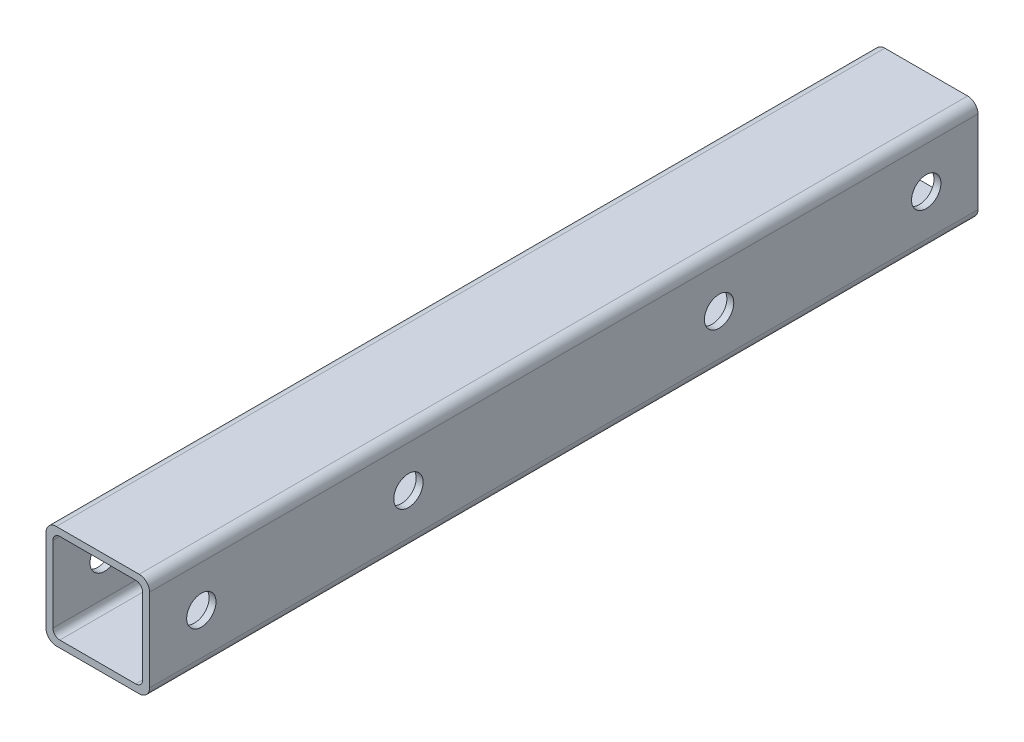
ISO-10303-21;
HEADER;
FILE_DESCRIPTION(('STEP AP214'),'2;1');
FILE_NAME('part.step','',(''),(''),'','','');
FILE_SCHEMA(('AUTOMOTIVE_DESIGN { 1 0 10303 214 1 1 1 1 }'));
ENDSEC;
DATA;
#1=APPLICATION_CONTEXT('core data for automotive mechanical design processes');
#2=APPLICATION_PROTOCOL_DEFINITION('international standard','automotive_design',2000,#1);
#3=PRODUCT_CONTEXT('',#1,'mechanical');
#4=PRODUCT('Part','Part','',(#3));
#5=PRODUCT_RELATED_PRODUCT_CATEGORY('part','',(#4));
#6=PRODUCT_DEFINITION_FORMATION('','',#4);
#7=PRODUCT_DEFINITION_CONTEXT('part definition',#1,'design');
#8=PRODUCT_DEFINITION('design','',#6,#7);
#9=PRODUCT_DEFINITION_SHAPE('','',#8);
#10=(LENGTH_UNIT() NAMED_UNIT(*) SI_UNIT(.MILLI.,.METRE.));
#11=(NAMED_UNIT(*) PLANE_ANGLE_UNIT() SI_UNIT($,.RADIAN.));
#12=(NAMED_UNIT(*) SI_UNIT($,.STERADIAN.) SOLID_ANGLE_UNIT());
#13=UNCERTAINTY_MEASURE_WITH_UNIT(LENGTH_MEASURE(1.E-05),#10,'distance_accuracy_value','');
#14=(GEOMETRIC_REPRESENTATION_CONTEXT(3) GLOBAL_UNCERTAINTY_ASSIGNED_CONTEXT((#13)) GLOBAL_UNIT_ASSIGNED_CONTEXT((#10,
#11,#12)) REPRESENTATION_CONTEXT('',''));
#15=CARTESIAN_POINT('',(0.,0.,0.));
#16=DIRECTION('',(0.,0.,1.));
#17=DIRECTION('',(1.,0.,0.));
#18=AXIS2_PLACEMENT_3D('',#15,#16,#17);
#19=CARTESIAN_POINT('',(-15.,27.,282.426406871193));
#20=DIRECTION('',(1.,0.,0.));
#21=DIRECTION('',(0.,0.,-1.));
#22=AXIS2_PLACEMENT_3D('',#19,#20,#21);
#23=PLANE('',#22);
#24=CARTESIAN_POINT('',(-15.,15.,225.));
#25=DIRECTION('',(1.,0.,0.));
#26=DIRECTION('',(0.,1.,0.));
#27=AXIS2_PLACEMENT_3D('',#24,#25,#26);
#28=CIRCLE('',#27,4.25);
#29=CARTESIAN_POINT('',(-15.,19.25,225.));
#30=VERTEX_POINT('',#29);
#31=EDGE_CURVE('E225',#30,#30,#28,.T.);
#32=ORIENTED_EDGE('',*,*,#31,.T.);
#33=EDGE_LOOP('',(#32));
#34=FACE_BOUND('',#33,.T.);
#35=CARTESIAN_POINT('',(-15.,15.,165.));
#36=DIRECTION('',(1.,0.,0.));
#37=DIRECTION('',(0.,1.,0.));
#38=AXIS2_PLACEMENT_3D('',#35,#36,#37);
#39=CIRCLE('',#38,4.25);
#40=CARTESIAN_POINT('',(-15.,19.25,165.));
#41=VERTEX_POINT('',#40);
#42=EDGE_CURVE('E534',#41,#41,#39,.T.);
#43=ORIENTED_EDGE('',*,*,#42,.T.);
#44=EDGE_LOOP('',(#43));
#45=FACE_BOUND('',#44,.T.);
#46=CARTESIAN_POINT('',(-15.,15.,74.9999999999999));
#47=DIRECTION('',(1.,0.,0.));
#48=DIRECTION('',(0.,1.,0.));
#49=AXIS2_PLACEMENT_3D('',#46,#47,#48);
#50=CIRCLE('',#49,4.25);
#51=CARTESIAN_POINT('',(-15.,19.25,74.9999999999999));
#52=VERTEX_POINT('',#51);
#53=EDGE_CURVE('E542',#52,#52,#50,.T.);
#54=ORIENTED_EDGE('',*,*,#53,.T.);
#55=EDGE_LOOP('',(#54));
#56=FACE_BOUND('',#55,.T.);
#57=CARTESIAN_POINT('',(-15.,15.,15.));
#58=DIRECTION('',(1.,0.,0.));
#59=DIRECTION('',(0.,1.,0.));
#60=AXIS2_PLACEMENT_3D('',#57,#58,#59);
#61=CIRCLE('',#60,4.25);
#62=CARTESIAN_POINT('',(-15.,19.25,15.));
#63=VERTEX_POINT('',#62);
#64=EDGE_CURVE('E548',#63,#63,#61,.T.);
#65=ORIENTED_EDGE('',*,*,#64,.T.);
#66=EDGE_LOOP('',(#65));
#67=FACE_BOUND('',#66,.T.);
#68=DIRECTION('',(0.,-1.,0.));
#69=VECTOR('',#68,1.);
#70=CARTESIAN_POINT('',(-15.,27.,240.));
#71=LINE('',#70,#69);
#72=CARTESIAN_POINT('',(-15.,27.,240.));
#73=VERTEX_POINT('',#72);
#74=CARTESIAN_POINT('',(-15.,3.00000000000001,240.));
#75=VERTEX_POINT('',#74);
#76=EDGE_CURVE('E259',#73,#75,#71,.T.);
#77=ORIENTED_EDGE('',*,*,#76,.F.);
#78=DIRECTION('',(0.,0.,-1.));
#79=VECTOR('',#78,1.);
#80=CARTESIAN_POINT('',(-15.,27.,282.426406871193));
#81=LINE('',#80,#79);
#82=CARTESIAN_POINT('',(-15.,27.,0.));
#83=VERTEX_POINT('',#82);
#84=EDGE_CURVE('E52',#73,#83,#81,.T.);
#85=ORIENTED_EDGE('',*,*,#84,.T.);
#86=DIRECTION('',(0.,-1.,0.));
#87=VECTOR('',#86,1.);
#88=CARTESIAN_POINT('',(-15.,27.,0.));
#89=LINE('',#88,#87);
#90=CARTESIAN_POINT('',(-15.,3.,0.));
#91=VERTEX_POINT('',#90);
#92=EDGE_CURVE('E204',#83,#91,#89,.T.);
#93=ORIENTED_EDGE('',*,*,#92,.T.);
#94=DIRECTION('',(0.,0.,-1.));
#95=VECTOR('',#94,1.);
#96=CARTESIAN_POINT('',(-15.,3.,282.426406871193));
#97=LINE('',#96,#95);
#98=EDGE_CURVE('E207',#75,#91,#97,.T.);
#99=ORIENTED_EDGE('',*,*,#98,.F.);
#100=EDGE_LOOP('',(#77,#85,#93,#99));
#101=FACE_BOUND('',#100,.T.);
#102=ADVANCED_FACE('F35',(#34,#45,#56,#67,#101),#23,.F.);
#103=CARTESIAN_POINT('',(-12.,27.,282.426406871193));
#104=DIRECTION('',(0.,0.,-1.));
#105=DIRECTION('',(-1.,0.,0.));
#106=AXIS2_PLACEMENT_3D('',#103,#104,#105);
#107=CYLINDRICAL_SURFACE('',#106,3.);
#108=CARTESIAN_POINT('',(-12.,27.,240.));
#109=DIRECTION('',(0.,0.,1.));
#110=DIRECTION('',(1.,0.,0.));
#111=AXIS2_PLACEMENT_3D('',#108,#109,#110);
#112=CIRCLE('',#111,3.);
#113=CARTESIAN_POINT('',(-12.,30.,240.));
#114=VERTEX_POINT('',#113);
#115=EDGE_CURVE('E262',#114,#73,#112,.T.);
#116=ORIENTED_EDGE('',*,*,#115,.F.);
#117=DIRECTION('',(0.,0.,-1.));
#118=VECTOR('',#117,1.);
#119=CARTESIAN_POINT('',(-12.,30.,282.426406871193));
#120=LINE('',#119,#118);
#121=CARTESIAN_POINT('',(-12.,30.,0.));
#122=VERTEX_POINT('',#121);
#123=EDGE_CURVE('E210',#114,#122,#120,.T.);
#124=ORIENTED_EDGE('',*,*,#123,.T.);
#125=CARTESIAN_POINT('',(-12.,27.,0.));
#126=DIRECTION('',(0.,0.,1.));
#127=DIRECTION('',(1.,0.,0.));
#128=AXIS2_PLACEMENT_3D('',#125,#126,#127);
#129=CIRCLE('',#128,3.);
#130=EDGE_CURVE('E202',#122,#83,#129,.T.);
#131=ORIENTED_EDGE('',*,*,#130,.T.);
#132=ORIENTED_EDGE('',*,*,#84,.F.);
#133=EDGE_LOOP('',(#116,#124,#131,#132));
#134=FACE_BOUND('',#133,.T.);
#135=ADVANCED_FACE('F338',(#134),#107,.T.);
#136=CARTESIAN_POINT('',(-12.,30.,282.426406871193));
#137=DIRECTION('',(0.,-1.,0.));
#138=DIRECTION('',(0.,0.,-1.));
#139=AXIS2_PLACEMENT_3D('',#136,#137,#138);
#140=PLANE('',#139);
#141=DIRECTION('',(-1.,0.,0.));
#142=VECTOR('',#141,1.);
#143=CARTESIAN_POINT('',(-12.,30.,240.));
#144=LINE('',#143,#142);
#145=CARTESIAN_POINT('',(12.,30.,240.));
#146=VERTEX_POINT('',#145);
#147=EDGE_CURVE('E265',#146,#114,#144,.T.);
#148=ORIENTED_EDGE('',*,*,#147,.F.);
#149=DIRECTION('',(0.,0.,-1.));
#150=VECTOR('',#149,1.);
#151=CARTESIAN_POINT('',(12.,30.,282.426406871193));
#152=LINE('',#151,#150);
#153=CARTESIAN_POINT('',(12.,30.,0.));
#154=VERTEX_POINT('',#153);
#155=EDGE_CURVE('E212',#146,#154,#152,.T.);
#156=ORIENTED_EDGE('',*,*,#155,.T.);
#157=DIRECTION('',(-1.,0.,0.));
#158=VECTOR('',#157,1.);
#159=CARTESIAN_POINT('',(-12.,30.,0.));
#160=LINE('',#159,#158);
#161=EDGE_CURVE('E199',#154,#122,#160,.T.);
#162=ORIENTED_EDGE('',*,*,#161,.T.);
#163=ORIENTED_EDGE('',*,*,#123,.F.);
#164=EDGE_LOOP('',(#148,#156,#162,#163));
#165=FACE_BOUND('',#164,.T.);
#166=ADVANCED_FACE('F344',(#165),#140,.F.);
#167=CARTESIAN_POINT('',(12.,27.,282.426406871193));
#168=DIRECTION('',(0.,0.,-1.));
#169=DIRECTION('',(-1.,0.,0.));
#170=AXIS2_PLACEMENT_3D('',#167,#168,#169);
#171=CYLINDRICAL_SURFACE('',#170,3.);
#172=CARTESIAN_POINT('',(12.,27.,240.));
#173=DIRECTION('',(0.,0.,1.));
#174=DIRECTION('',(1.,0.,0.));
#175=AXIS2_PLACEMENT_3D('',#172,#173,#174);
#176=CIRCLE('',#175,3.);
#177=CARTESIAN_POINT('',(15.,27.,240.));
#178=VERTEX_POINT('',#177);
#179=EDGE_CURVE('E268',#178,#146,#176,.T.);
#180=ORIENTED_EDGE('',*,*,#179,.F.);
#181=DIRECTION('',(0.,0.,-1.));
#182=VECTOR('',#181,1.);
#183=CARTESIAN_POINT('',(15.,27.,282.426406871193));
#184=LINE('',#183,#182);
#185=CARTESIAN_POINT('',(15.,27.,0.));
#186=VERTEX_POINT('',#185);
#187=EDGE_CURVE('E214',#178,#186,#184,.T.);
#188=ORIENTED_EDGE('',*,*,#187,.T.);
#189=CARTESIAN_POINT('',(12.,27.,0.));
#190=DIRECTION('',(0.,0.,1.));
#191=DIRECTION('',(-1.,0.,0.));
#192=AXIS2_PLACEMENT_3D('',#189,#190,#191);
#193=CIRCLE('',#192,3.);
#194=EDGE_CURVE('E196',#186,#154,#193,.T.);
#195=ORIENTED_EDGE('',*,*,#194,.T.);
#196=ORIENTED_EDGE('',*,*,#155,.F.);
#197=EDGE_LOOP('',(#180,#188,#195,#196));
#198=FACE_BOUND('',#197,.T.);
#199=ADVANCED_FACE('F351',(#198),#171,.T.);
#200=CARTESIAN_POINT('',(15.,27.,282.426406871193));
#201=DIRECTION('',(-1.,0.,0.));
#202=DIRECTION('',(0.,-1.,0.));
#203=AXIS2_PLACEMENT_3D('',#200,#201,#202);
#204=PLANE('',#203);
#205=CARTESIAN_POINT('',(15.,15.,225.));
#206=DIRECTION('',(1.,0.,0.));
#207=DIRECTION('',(0.,1.,0.));
#208=AXIS2_PLACEMENT_3D('',#205,#206,#207);
#209=CIRCLE('',#208,4.25);
#210=CARTESIAN_POINT('',(15.,19.25,225.));
#211=VERTEX_POINT('',#210);
#212=EDGE_CURVE('E531',#211,#211,#209,.T.);
#213=ORIENTED_EDGE('',*,*,#212,.F.);
#214=EDGE_LOOP('',(#213));
#215=FACE_BOUND('',#214,.T.);
#216=CARTESIAN_POINT('',(15.,15.,165.));
#217=DIRECTION('',(1.,0.,0.));
#218=DIRECTION('',(0.,1.,0.));
#219=AXIS2_PLACEMENT_3D('',#216,#217,#218);
#220=CIRCLE('',#219,4.25);
#221=CARTESIAN_POINT('',(15.,19.25,165.));
#222=VERTEX_POINT('',#221);
#223=EDGE_CURVE('E539',#222,#222,#220,.T.);
#224=ORIENTED_EDGE('',*,*,#223,.F.);
#225=EDGE_LOOP('',(#224));
#226=FACE_BOUND('',#225,.T.);
#227=CARTESIAN_POINT('',(15.,15.,74.9999999999999));
#228=DIRECTION('',(1.,0.,0.));
#229=DIRECTION('',(0.,1.,0.));
#230=AXIS2_PLACEMENT_3D('',#227,#228,#229);
#231=CIRCLE('',#230,4.25);
#232=CARTESIAN_POINT('',(15.,19.25,74.9999999999999));
#233=VERTEX_POINT('',#232);
#234=EDGE_CURVE('E545',#233,#233,#231,.T.);
#235=ORIENTED_EDGE('',*,*,#234,.F.);
#236=EDGE_LOOP('',(#235));
#237=FACE_BOUND('',#236,.T.);
#238=CARTESIAN_POINT('',(15.,15.,15.));
#239=DIRECTION('',(1.,0.,0.));
#240=DIRECTION('',(0.,1.,0.));
#241=AXIS2_PLACEMENT_3D('',#238,#239,#240);
#242=CIRCLE('',#241,4.25);
#243=CARTESIAN_POINT('',(15.,19.25,15.));
#244=VERTEX_POINT('',#243);
#245=EDGE_CURVE('E550',#244,#244,#242,.T.);
#246=ORIENTED_EDGE('',*,*,#245,.F.);
#247=EDGE_LOOP('',(#246));
#248=FACE_BOUND('',#247,.T.);
#249=DIRECTION('',(0.,1.,0.));
#250=VECTOR('',#249,1.);
#251=CARTESIAN_POINT('',(15.,27.,240.));
#252=LINE('',#251,#250);
#253=CARTESIAN_POINT('',(15.,3.,240.));
#254=VERTEX_POINT('',#253);
#255=EDGE_CURVE('E271',#254,#178,#252,.T.);
#256=ORIENTED_EDGE('',*,*,#255,.F.);
#257=DIRECTION('',(0.,0.,-1.));
#258=VECTOR('',#257,1.);
#259=CARTESIAN_POINT('',(15.,3.,282.426406871193));
#260=LINE('',#259,#258);
#261=CARTESIAN_POINT('',(15.,3.,0.));
#262=VERTEX_POINT('',#261);
#263=EDGE_CURVE('E216',#254,#262,#260,.T.);
#264=ORIENTED_EDGE('',*,*,#263,.T.);
#265=DIRECTION('',(0.,1.,0.));
#266=VECTOR('',#265,1.);
#267=CARTESIAN_POINT('',(15.,27.,0.));
#268=LINE('',#267,#266);
#269=EDGE_CURVE('E193',#262,#186,#268,.T.);
#270=ORIENTED_EDGE('',*,*,#269,.T.);
#271=ORIENTED_EDGE('',*,*,#187,.F.);
#272=EDGE_LOOP('',(#256,#264,#270,#271));
#273=FACE_BOUND('',#272,.T.);
#274=ADVANCED_FACE('F355',(#215,#226,#237,#248,#273),#204,.F.);
#275=CARTESIAN_POINT('',(12.,3.,282.426406871193));
#276=DIRECTION('',(0.,0.,-1.));
#277=DIRECTION('',(-1.,0.,0.));
#278=AXIS2_PLACEMENT_3D('',#275,#276,#277);
#279=CYLINDRICAL_SURFACE('',#278,3.);
#280=CARTESIAN_POINT('',(12.,3.,240.));
#281=DIRECTION('',(0.,0.,1.));
#282=DIRECTION('',(1.,0.,0.));
#283=AXIS2_PLACEMENT_3D('',#280,#281,#282);
#284=CIRCLE('',#283,3.);
#285=CARTESIAN_POINT('',(12.,0.,240.));
#286=VERTEX_POINT('',#285);
#287=EDGE_CURVE('E274',#286,#254,#284,.T.);
#288=ORIENTED_EDGE('',*,*,#287,.F.);
#289=DIRECTION('',(0.,0.,-1.));
#290=VECTOR('',#289,1.);
#291=CARTESIAN_POINT('',(12.,0.,282.426406871193));
#292=LINE('',#291,#290);
#293=CARTESIAN_POINT('',(12.,0.,0.));
#294=VERTEX_POINT('',#293);
#295=EDGE_CURVE('E218',#286,#294,#292,.T.);
#296=ORIENTED_EDGE('',*,*,#295,.T.);
#297=CARTESIAN_POINT('',(12.,3.,0.));
#298=DIRECTION('',(0.,0.,1.));
#299=DIRECTION('',(1.,0.,0.));
#300=AXIS2_PLACEMENT_3D('',#297,#298,#299);
#301=CIRCLE('',#300,3.);
#302=EDGE_CURVE('E190',#294,#262,#301,.T.);
#303=ORIENTED_EDGE('',*,*,#302,.T.);
#304=ORIENTED_EDGE('',*,*,#263,.F.);
#305=EDGE_LOOP('',(#288,#296,#303,#304));
#306=FACE_BOUND('',#305,.T.);
#307=ADVANCED_FACE('F359',(#306),#279,.T.);
#308=CARTESIAN_POINT('',(-12.,0.,282.426406871193));
#309=DIRECTION('',(0.,1.,0.));
#310=DIRECTION('',(-1.,0.,0.));
#311=AXIS2_PLACEMENT_3D('',#308,#309,#310);
#312=PLANE('',#311);
#313=DIRECTION('',(1.,0.,0.));
#314=VECTOR('',#313,1.);
#315=CARTESIAN_POINT('',(-12.,0.,240.));
#316=LINE('',#315,#314);
#317=CARTESIAN_POINT('',(-12.,0.,240.));
#318=VERTEX_POINT('',#317);
#319=EDGE_CURVE('E277',#318,#286,#316,.T.);
#320=ORIENTED_EDGE('',*,*,#319,.F.);
#321=DIRECTION('',(0.,0.,-1.));
#322=VECTOR('',#321,1.);
#323=CARTESIAN_POINT('',(-12.,0.,282.426406871193));
#324=LINE('',#323,#322);
#325=CARTESIAN_POINT('',(-12.,0.,0.));
#326=VERTEX_POINT('',#325);
#327=EDGE_CURVE('E44',#318,#326,#324,.T.);
#328=ORIENTED_EDGE('',*,*,#327,.T.);
#329=DIRECTION('',(1.,0.,0.));
#330=VECTOR('',#329,1.);
#331=CARTESIAN_POINT('',(-12.,0.,0.));
#332=LINE('',#331,#330);
#333=EDGE_CURVE('E187',#326,#294,#332,.T.);
#334=ORIENTED_EDGE('',*,*,#333,.T.);
#335=ORIENTED_EDGE('',*,*,#295,.F.);
#336=EDGE_LOOP('',(#320,#328,#334,#335));
#337=FACE_BOUND('',#336,.T.);
#338=ADVANCED_FACE('F362',(#337),#312,.F.);
#339=CARTESIAN_POINT('',(-12.,3.,282.426406871193));
#340=DIRECTION('',(0.,0.,-1.));
#341=DIRECTION('',(-1.,0.,0.));
#342=AXIS2_PLACEMENT_3D('',#339,#340,#341);
#343=CYLINDRICAL_SURFACE('',#342,3.);
#344=CARTESIAN_POINT('',(-12.,3.,240.));
#345=DIRECTION('',(0.,0.,1.));
#346=DIRECTION('',(1.,0.,0.));
#347=AXIS2_PLACEMENT_3D('',#344,#345,#346);
#348=CIRCLE('',#347,3.);
#349=EDGE_CURVE('E280',#75,#318,#348,.T.);
#350=ORIENTED_EDGE('',*,*,#349,.F.);
#351=ORIENTED_EDGE('',*,*,#98,.T.);
#352=CARTESIAN_POINT('',(-12.,3.,0.));
#353=DIRECTION('',(0.,0.,1.));
#354=DIRECTION('',(1.,0.,0.));
#355=AXIS2_PLACEMENT_3D('',#352,#353,#354);
#356=CIRCLE('',#355,3.);
#357=EDGE_CURVE('E184',#91,#326,#356,.T.);
#358=ORIENTED_EDGE('',*,*,#357,.T.);
#359=ORIENTED_EDGE('',*,*,#327,.F.);
#360=EDGE_LOOP('',(#350,#351,#358,#359));
#361=FACE_BOUND('',#360,.T.);
#362=ADVANCED_FACE('F37',(#361),#343,.T.);
#363=CARTESIAN_POINT('',(-12.,3.,0.));
#364=DIRECTION('',(0.,0.,1.));
#365=DIRECTION('',(1.,0.,0.));
#366=AXIS2_PLACEMENT_3D('',#363,#364,#365);
#367=PLANE('',#366);
#368=ORIENTED_EDGE('',*,*,#357,.F.);
#369=ORIENTED_EDGE('',*,*,#92,.F.);
#370=ORIENTED_EDGE('',*,*,#130,.F.);
#371=ORIENTED_EDGE('',*,*,#161,.F.);
#372=ORIENTED_EDGE('',*,*,#194,.F.);
#373=ORIENTED_EDGE('',*,*,#269,.F.);
#374=ORIENTED_EDGE('',*,*,#302,.F.);
#375=ORIENTED_EDGE('',*,*,#333,.F.);
#376=EDGE_LOOP('',(#368,#369,#370,#371,#372,#373,#374,#375));
#377=FACE_BOUND('',#376,.T.);
#378=CARTESIAN_POINT('',(-11.,4.00000000000001,0.));
#379=DIRECTION('',(0.,0.,1.));
#380=DIRECTION('',(1.,0.,0.));
#381=AXIS2_PLACEMENT_3D('',#378,#379,#380);
#382=CIRCLE('',#381,2.);
#383=CARTESIAN_POINT('',(-13.,4.00000000000002,0.));
#384=VERTEX_POINT('',#383);
#385=CARTESIAN_POINT('',(-11.,2.00000000000001,0.));
#386=VERTEX_POINT('',#385);
#387=EDGE_CURVE('E283',#384,#386,#382,.T.);
#388=ORIENTED_EDGE('',*,*,#387,.T.);
#389=DIRECTION('',(1.,0.,0.));
#390=VECTOR('',#389,1.);
#391=CARTESIAN_POINT('',(-11.,2.00000000000001,0.));
#392=LINE('',#391,#390);
#393=CARTESIAN_POINT('',(11.,2.,0.));
#394=VERTEX_POINT('',#393);
#395=EDGE_CURVE('E286',#386,#394,#392,.T.);
#396=ORIENTED_EDGE('',*,*,#395,.T.);
#397=CARTESIAN_POINT('',(11.,4.00000000000001,0.));
#398=DIRECTION('',(0.,0.,1.));
#399=DIRECTION('',(1.,0.,0.));
#400=AXIS2_PLACEMENT_3D('',#397,#398,#399);
#401=CIRCLE('',#400,2.);
#402=CARTESIAN_POINT('',(13.,4.00000000000002,0.));
#403=VERTEX_POINT('',#402);
#404=EDGE_CURVE('E289',#394,#403,#401,.T.);
#405=ORIENTED_EDGE('',*,*,#404,.T.);
#406=DIRECTION('',(0.,1.,0.));
#407=VECTOR('',#406,1.);
#408=CARTESIAN_POINT('',(13.,26.,0.));
#409=LINE('',#408,#407);
#410=CARTESIAN_POINT('',(13.,26.,0.));
#411=VERTEX_POINT('',#410);
#412=EDGE_CURVE('E292',#403,#411,#409,.T.);
#413=ORIENTED_EDGE('',*,*,#412,.T.);
#414=CARTESIAN_POINT('',(11.,26.,0.));
#415=DIRECTION('',(0.,0.,1.));
#416=DIRECTION('',(-1.,0.,0.));
#417=AXIS2_PLACEMENT_3D('',#414,#415,#416);
#418=CIRCLE('',#417,2.);
#419=CARTESIAN_POINT('',(11.,28.,0.));
#420=VERTEX_POINT('',#419);
#421=EDGE_CURVE('E295',#411,#420,#418,.T.);
#422=ORIENTED_EDGE('',*,*,#421,.T.);
#423=DIRECTION('',(-1.,0.,0.));
#424=VECTOR('',#423,1.);
#425=CARTESIAN_POINT('',(-11.,28.,0.));
#426=LINE('',#425,#424);
#427=CARTESIAN_POINT('',(-11.,28.,0.));
#428=VERTEX_POINT('',#427);
#429=EDGE_CURVE('E298',#420,#428,#426,.T.);
#430=ORIENTED_EDGE('',*,*,#429,.T.);
#431=CARTESIAN_POINT('',(-11.,26.,0.));
#432=DIRECTION('',(0.,0.,1.));
#433=DIRECTION('',(1.,0.,0.));
#434=AXIS2_PLACEMENT_3D('',#431,#432,#433);
#435=CIRCLE('',#434,2.);
#436=CARTESIAN_POINT('',(-13.,26.,0.));
#437=VERTEX_POINT('',#436);
#438=EDGE_CURVE('E301',#428,#437,#435,.T.);
#439=ORIENTED_EDGE('',*,*,#438,.T.);
#440=DIRECTION('',(0.,-1.,0.));
#441=VECTOR('',#440,1.);
#442=CARTESIAN_POINT('',(-13.,26.,0.));
#443=LINE('',#442,#441);
#444=EDGE_CURVE('E166',#437,#384,#443,.T.);
#445=ORIENTED_EDGE('',*,*,#444,.T.);
#446=EDGE_LOOP('',(#388,#396,#405,#413,#422,#430,#439,#445));
#447=FACE_BOUND('',#446,.T.);
#448=ADVANCED_FACE('F303',(#377,#447),#367,.F.);
#449=CARTESIAN_POINT('',(-13.,26.,282.426406871193));
#450=DIRECTION('',(1.,0.,0.));
#451=DIRECTION('',(0.,0.,-1.));
#452=AXIS2_PLACEMENT_3D('',#449,#450,#451);
#453=PLANE('',#452);
#454=CARTESIAN_POINT('',(-13.,15.,225.));
#455=DIRECTION('',(1.,0.,0.));
#456=DIRECTION('',(0.,0.,-1.));
#457=AXIS2_PLACEMENT_3D('',#454,#455,#456);
#458=CIRCLE('',#457,4.25);
#459=CARTESIAN_POINT('',(-13.,15.,220.75));
#460=VERTEX_POINT('',#459);
#461=EDGE_CURVE('E162',#460,#460,#458,.T.);
#462=ORIENTED_EDGE('',*,*,#461,.F.);
#463=EDGE_LOOP('',(#462));
#464=FACE_BOUND('',#463,.T.);
#465=CARTESIAN_POINT('',(-13.,15.,165.));
#466=DIRECTION('',(1.,0.,0.));
#467=DIRECTION('',(0.,0.,-1.));
#468=AXIS2_PLACEMENT_3D('',#465,#466,#467);
#469=CIRCLE('',#468,4.25);
#470=CARTESIAN_POINT('',(-13.,15.,160.75));
#471=VERTEX_POINT('',#470);
#472=EDGE_CURVE('E231',#471,#471,#469,.T.);
#473=ORIENTED_EDGE('',*,*,#472,.F.);
#474=EDGE_LOOP('',(#473));
#475=FACE_BOUND('',#474,.T.);
#476=CARTESIAN_POINT('',(-13.,15.,74.9999999999999));
#477=DIRECTION('',(1.,0.,0.));
#478=DIRECTION('',(0.,0.,-1.));
#479=AXIS2_PLACEMENT_3D('',#476,#477,#478);
#480=CIRCLE('',#479,4.25);
#481=CARTESIAN_POINT('',(-13.,15.,70.7499999999999));
#482=VERTEX_POINT('',#481);
#483=EDGE_CURVE('E228',#482,#482,#480,.T.);
#484=ORIENTED_EDGE('',*,*,#483,.F.);
#485=EDGE_LOOP('',(#484));
#486=FACE_BOUND('',#485,.T.);
#487=CARTESIAN_POINT('',(-13.,15.,15.));
#488=DIRECTION('',(1.,0.,0.));
#489=DIRECTION('',(0.,0.,-1.));
#490=AXIS2_PLACEMENT_3D('',#487,#488,#489);
#491=CIRCLE('',#490,4.25);
#492=CARTESIAN_POINT('',(-13.,15.,10.75));
#493=VERTEX_POINT('',#492);
#494=EDGE_CURVE('E224',#493,#493,#491,.T.);
#495=ORIENTED_EDGE('',*,*,#494,.F.);
#496=EDGE_LOOP('',(#495));
#497=FACE_BOUND('',#496,.T.);
#498=DIRECTION('',(0.,0.,-1.));
#499=VECTOR('',#498,1.);
#500=CARTESIAN_POINT('',(-13.,26.,282.426406871193));
#501=LINE('',#500,#499);
#502=CARTESIAN_POINT('',(-13.,26.,240.));
#503=VERTEX_POINT('',#502);
#504=EDGE_CURVE('E157',#503,#437,#501,.T.);
#505=ORIENTED_EDGE('',*,*,#504,.F.);
#506=DIRECTION('',(0.,-1.,0.));
#507=VECTOR('',#506,1.);
#508=CARTESIAN_POINT('',(-13.,26.,240.));
#509=LINE('',#508,#507);
#510=CARTESIAN_POINT('',(-13.,4.00000000000002,240.));
#511=VERTEX_POINT('',#510);
#512=EDGE_CURVE('E11',#503,#511,#509,.T.);
#513=ORIENTED_EDGE('',*,*,#512,.T.);
#514=DIRECTION('',(0.,0.,-1.));
#515=VECTOR('',#514,1.);
#516=CARTESIAN_POINT('',(-13.,4.00000000000002,282.426406871193));
#517=LINE('',#516,#515);
#518=EDGE_CURVE('E168',#511,#384,#517,.T.);
#519=ORIENTED_EDGE('',*,*,#518,.T.);
#520=ORIENTED_EDGE('',*,*,#444,.F.);
#521=EDGE_LOOP('',(#505,#513,#519,#520));
#522=FACE_BOUND('',#521,.T.);
#523=ADVANCED_FACE('F164',(#464,#475,#486,#497,#522),#453,.T.);
#524=CARTESIAN_POINT('',(-11.,26.,282.426406871193));
#525=DIRECTION('',(0.,0.,-1.));
#526=DIRECTION('',(-1.,0.,0.));
#527=AXIS2_PLACEMENT_3D('',#524,#525,#526);
#528=CYLINDRICAL_SURFACE('',#527,2.);
#529=DIRECTION('',(0.,0.,-1.));
#530=VECTOR('',#529,1.);
#531=CARTESIAN_POINT('',(-11.,28.,282.426406871193));
#532=LINE('',#531,#530);
#533=CARTESIAN_POINT('',(-11.,28.,240.));
#534=VERTEX_POINT('',#533);
#535=EDGE_CURVE('E159',#534,#428,#532,.T.);
#536=ORIENTED_EDGE('',*,*,#535,.F.);
#537=CARTESIAN_POINT('',(-11.,26.,240.));
#538=DIRECTION('',(0.,0.,1.));
#539=DIRECTION('',(1.,0.,0.));
#540=AXIS2_PLACEMENT_3D('',#537,#538,#539);
#541=CIRCLE('',#540,2.);
#542=EDGE_CURVE('E150',#534,#503,#541,.T.);
#543=ORIENTED_EDGE('',*,*,#542,.T.);
#544=ORIENTED_EDGE('',*,*,#504,.T.);
#545=ORIENTED_EDGE('',*,*,#438,.F.);
#546=EDGE_LOOP('',(#536,#543,#544,#545));
#547=FACE_BOUND('',#546,.T.);
#548=ADVANCED_FACE('F155',(#547),#528,.F.);
#549=CARTESIAN_POINT('',(-11.,28.,282.426406871193));
#550=DIRECTION('',(0.,-1.,0.));
#551=DIRECTION('',(0.,0.,-1.));
#552=AXIS2_PLACEMENT_3D('',#549,#550,#551);
#553=PLANE('',#552);
#554=DIRECTION('',(0.,0.,-1.));
#555=VECTOR('',#554,1.);
#556=CARTESIAN_POINT('',(11.,28.,282.426406871193));
#557=LINE('',#556,#555);
#558=CARTESIAN_POINT('',(11.,28.,240.));
#559=VERTEX_POINT('',#558);
#560=EDGE_CURVE('E170',#559,#420,#557,.T.);
#561=ORIENTED_EDGE('',*,*,#560,.F.);
#562=DIRECTION('',(-1.,0.,0.));
#563=VECTOR('',#562,1.);
#564=CARTESIAN_POINT('',(-11.,28.,240.));
#565=LINE('',#564,#563);
#566=EDGE_CURVE('E161',#559,#534,#565,.T.);
#567=ORIENTED_EDGE('',*,*,#566,.T.);
#568=ORIENTED_EDGE('',*,*,#535,.T.);
#569=ORIENTED_EDGE('',*,*,#429,.F.);
#570=EDGE_LOOP('',(#561,#567,#568,#569));
#571=FACE_BOUND('',#570,.T.);
#572=ADVANCED_FACE('F309',(#571),#553,.T.);
#573=CARTESIAN_POINT('',(11.,26.,282.426406871193));
#574=DIRECTION('',(0.,0.,-1.));
#575=DIRECTION('',(-1.,0.,0.));
#576=AXIS2_PLACEMENT_3D('',#573,#574,#575);
#577=CYLINDRICAL_SURFACE('',#576,2.);
#578=DIRECTION('',(0.,0.,-1.));
#579=VECTOR('',#578,1.);
#580=CARTESIAN_POINT('',(13.,26.,282.426406871193));
#581=LINE('',#580,#579);
#582=CARTESIAN_POINT('',(13.,26.,240.));
#583=VERTEX_POINT('',#582);
#584=EDGE_CURVE('E176',#583,#411,#581,.T.);
#585=ORIENTED_EDGE('',*,*,#584,.F.);
#586=CARTESIAN_POINT('',(11.,26.,240.));
#587=DIRECTION('',(0.,0.,1.));
#588=DIRECTION('',(1.,0.,0.));
#589=AXIS2_PLACEMENT_3D('',#586,#587,#588);
#590=CIRCLE('',#589,2.);
#591=EDGE_CURVE('E246',#583,#559,#590,.T.);
#592=ORIENTED_EDGE('',*,*,#591,.T.);
#593=ORIENTED_EDGE('',*,*,#560,.T.);
#594=ORIENTED_EDGE('',*,*,#421,.F.);
#595=EDGE_LOOP('',(#585,#592,#593,#594));
#596=FACE_BOUND('',#595,.T.);
#597=ADVANCED_FACE('F313',(#596),#577,.F.);
#598=CARTESIAN_POINT('',(13.,26.,282.426406871193));
#599=DIRECTION('',(-1.,0.,0.));
#600=DIRECTION('',(0.,0.,1.));
#601=AXIS2_PLACEMENT_3D('',#598,#599,#600);
#602=PLANE('',#601);
#603=CARTESIAN_POINT('',(13.,15.,225.));
#604=DIRECTION('',(-1.,0.,0.));
#605=DIRECTION('',(0.,0.,1.));
#606=AXIS2_PLACEMENT_3D('',#603,#604,#605);
#607=CIRCLE('',#606,4.25);
#608=CARTESIAN_POINT('',(13.,15.,229.25));
#609=VERTEX_POINT('',#608);
#610=EDGE_CURVE('E39',#609,#609,#607,.T.);
#611=ORIENTED_EDGE('',*,*,#610,.F.);
#612=EDGE_LOOP('',(#611));
#613=FACE_BOUND('',#612,.T.);
#614=CARTESIAN_POINT('',(13.,15.,165.));
#615=DIRECTION('',(-1.,0.,0.));
#616=DIRECTION('',(0.,0.,1.));
#617=AXIS2_PLACEMENT_3D('',#614,#615,#616);
#618=CIRCLE('',#617,4.25);
#619=CARTESIAN_POINT('',(13.,15.,169.25));
#620=VERTEX_POINT('',#619);
#621=EDGE_CURVE('E229',#620,#620,#618,.T.);
#622=ORIENTED_EDGE('',*,*,#621,.F.);
#623=EDGE_LOOP('',(#622));
#624=FACE_BOUND('',#623,.T.);
#625=CARTESIAN_POINT('',(13.,15.,74.9999999999999));
#626=DIRECTION('',(-1.,0.,0.));
#627=DIRECTION('',(0.,0.,1.));
#628=AXIS2_PLACEMENT_3D('',#625,#626,#627);
#629=CIRCLE('',#628,4.25);
#630=CARTESIAN_POINT('',(13.,15.,79.2499999999999));
#631=VERTEX_POINT('',#630);
#632=EDGE_CURVE('E226',#631,#631,#629,.T.);
#633=ORIENTED_EDGE('',*,*,#632,.F.);
#634=EDGE_LOOP('',(#633));
#635=FACE_BOUND('',#634,.T.);
#636=CARTESIAN_POINT('',(13.,15.,15.));
#637=DIRECTION('',(-1.,0.,0.));
#638=DIRECTION('',(0.,0.,1.));
#639=AXIS2_PLACEMENT_3D('',#636,#637,#638);
#640=CIRCLE('',#639,4.25);
#641=CARTESIAN_POINT('',(13.,15.,19.25));
#642=VERTEX_POINT('',#641);
#643=EDGE_CURVE('E221',#642,#642,#640,.T.);
#644=ORIENTED_EDGE('',*,*,#643,.F.);
#645=EDGE_LOOP('',(#644));
#646=FACE_BOUND('',#645,.T.);
#647=DIRECTION('',(0.,0.,-1.));
#648=VECTOR('',#647,1.);
#649=CARTESIAN_POINT('',(13.,4.00000000000002,282.426406871193));
#650=LINE('',#649,#648);
#651=CARTESIAN_POINT('',(13.,4.00000000000002,240.));
#652=VERTEX_POINT('',#651);
#653=EDGE_CURVE('E178',#652,#403,#650,.T.);
#654=ORIENTED_EDGE('',*,*,#653,.F.);
#655=DIRECTION('',(0.,1.,0.));
#656=VECTOR('',#655,1.);
#657=CARTESIAN_POINT('',(13.,26.,240.));
#658=LINE('',#657,#656);
#659=EDGE_CURVE('E249',#652,#583,#658,.T.);
#660=ORIENTED_EDGE('',*,*,#659,.T.);
#661=ORIENTED_EDGE('',*,*,#584,.T.);
#662=ORIENTED_EDGE('',*,*,#412,.F.);
#663=EDGE_LOOP('',(#654,#660,#661,#662));
#664=FACE_BOUND('',#663,.T.);
#665=ADVANCED_FACE('F316',(#613,#624,#635,#646,#664),#602,.T.);
#666=CARTESIAN_POINT('',(11.,4.00000000000001,282.426406871193));
#667=DIRECTION('',(0.,0.,-1.));
#668=DIRECTION('',(-1.,0.,0.));
#669=AXIS2_PLACEMENT_3D('',#666,#667,#668);
#670=CYLINDRICAL_SURFACE('',#669,2.);
#671=DIRECTION('',(0.,0.,-1.));
#672=VECTOR('',#671,1.);
#673=CARTESIAN_POINT('',(11.,2.,282.426406871193));
#674=LINE('',#673,#672);
#675=CARTESIAN_POINT('',(11.,2.,240.));
#676=VERTEX_POINT('',#675);
#677=EDGE_CURVE('E180',#676,#394,#674,.T.);
#678=ORIENTED_EDGE('',*,*,#677,.F.);
#679=CARTESIAN_POINT('',(11.,4.00000000000001,240.));
#680=DIRECTION('',(0.,0.,1.));
#681=DIRECTION('',(1.,0.,0.));
#682=AXIS2_PLACEMENT_3D('',#679,#680,#681);
#683=CIRCLE('',#682,2.);
#684=EDGE_CURVE('E252',#676,#652,#683,.T.);
#685=ORIENTED_EDGE('',*,*,#684,.T.);
#686=ORIENTED_EDGE('',*,*,#653,.T.);
#687=ORIENTED_EDGE('',*,*,#404,.F.);
#688=EDGE_LOOP('',(#678,#685,#686,#687));
#689=FACE_BOUND('',#688,.T.);
#690=ADVANCED_FACE('F320',(#689),#670,.F.);
#691=CARTESIAN_POINT('',(-11.,2.00000000000001,282.426406871193));
#692=DIRECTION('',(0.,1.,0.));
#693=DIRECTION('',(0.,0.,1.));
#694=AXIS2_PLACEMENT_3D('',#691,#692,#693);
#695=PLANE('',#694);
#696=DIRECTION('',(0.,0.,-1.));
#697=VECTOR('',#696,1.);
#698=CARTESIAN_POINT('',(-11.,2.00000000000001,282.426406871193));
#699=LINE('',#698,#697);
#700=CARTESIAN_POINT('',(-11.,2.00000000000001,240.));
#701=VERTEX_POINT('',#700);
#702=EDGE_CURVE('E182',#701,#386,#699,.T.);
#703=ORIENTED_EDGE('',*,*,#702,.F.);
#704=DIRECTION('',(1.,0.,0.));
#705=VECTOR('',#704,1.);
#706=CARTESIAN_POINT('',(-11.,2.00000000000001,240.));
#707=LINE('',#706,#705);
#708=EDGE_CURVE('E255',#701,#676,#707,.T.);
#709=ORIENTED_EDGE('',*,*,#708,.T.);
#710=ORIENTED_EDGE('',*,*,#677,.T.);
#711=ORIENTED_EDGE('',*,*,#395,.F.);
#712=EDGE_LOOP('',(#703,#709,#710,#711));
#713=FACE_BOUND('',#712,.T.);
#714=ADVANCED_FACE('F324',(#713),#695,.T.);
#715=CARTESIAN_POINT('',(-11.,4.00000000000001,282.426406871193));
#716=DIRECTION('',(0.,0.,-1.));
#717=DIRECTION('',(-1.,0.,0.));
#718=AXIS2_PLACEMENT_3D('',#715,#716,#717);
#719=CYLINDRICAL_SURFACE('',#718,2.);
#720=ORIENTED_EDGE('',*,*,#518,.F.);
#721=CARTESIAN_POINT('',(-11.,4.00000000000001,240.));
#722=DIRECTION('',(0.,0.,1.));
#723=DIRECTION('',(1.,0.,0.));
#724=AXIS2_PLACEMENT_3D('',#721,#722,#723);
#725=CIRCLE('',#724,2.);
#726=EDGE_CURVE('E60',#511,#701,#725,.T.);
#727=ORIENTED_EDGE('',*,*,#726,.T.);
#728=ORIENTED_EDGE('',*,*,#702,.T.);
#729=ORIENTED_EDGE('',*,*,#387,.F.);
#730=EDGE_LOOP('',(#720,#727,#728,#729));
#731=FACE_BOUND('',#730,.T.);
#732=ADVANCED_FACE('F326',(#731),#719,.F.);
#733=CARTESIAN_POINT('',(-12.,2000.,240.));
#734=DIRECTION('',(0.,0.,1.));
#735=DIRECTION('',(1.,0.,0.));
#736=AXIS2_PLACEMENT_3D('',#733,#734,#735);
#737=PLANE('',#736);
#738=ORIENTED_EDGE('',*,*,#726,.F.);
#739=ORIENTED_EDGE('',*,*,#512,.F.);
#740=ORIENTED_EDGE('',*,*,#542,.F.);
#741=ORIENTED_EDGE('',*,*,#566,.F.);
#742=ORIENTED_EDGE('',*,*,#591,.F.);
#743=ORIENTED_EDGE('',*,*,#659,.F.);
#744=ORIENTED_EDGE('',*,*,#684,.F.);
#745=ORIENTED_EDGE('',*,*,#708,.F.);
#746=EDGE_LOOP('',(#738,#739,#740,#741,#742,#743,#744,#745));
#747=FACE_BOUND('',#746,.T.);
#748=ORIENTED_EDGE('',*,*,#76,.T.);
#749=ORIENTED_EDGE('',*,*,#349,.T.);
#750=ORIENTED_EDGE('',*,*,#319,.T.);
#751=ORIENTED_EDGE('',*,*,#287,.T.);
#752=ORIENTED_EDGE('',*,*,#255,.T.);
#753=ORIENTED_EDGE('',*,*,#179,.T.);
#754=ORIENTED_EDGE('',*,*,#147,.T.);
#755=ORIENTED_EDGE('',*,*,#115,.T.);
#756=EDGE_LOOP('',(#748,#749,#750,#751,#752,#753,#754,#755));
#757=FACE_BOUND('',#756,.T.);
#758=ADVANCED_FACE('F148',(#747,#757),#737,.T.);
#759=CARTESIAN_POINT('',(-15.,15.,15.));
#760=DIRECTION('',(1.,0.,0.));
#761=DIRECTION('',(0.,1.,0.));
#762=AXIS2_PLACEMENT_3D('',#759,#760,#761);
#763=CYLINDRICAL_SURFACE('',#762,4.25);
#764=ORIENTED_EDGE('',*,*,#643,.T.);
#765=EDGE_LOOP('',(#764));
#766=FACE_BOUND('',#765,.T.);
#767=ORIENTED_EDGE('',*,*,#245,.T.);
#768=EDGE_LOOP('',(#767));
#769=FACE_BOUND('',#768,.T.);
#770=ADVANCED_FACE('F333',(#766,#769),#763,.F.);
#771=CARTESIAN_POINT('',(-15.,15.,74.9999999999999));
#772=DIRECTION('',(1.,0.,0.));
#773=DIRECTION('',(0.,1.,0.));
#774=AXIS2_PLACEMENT_3D('',#771,#772,#773);
#775=CYLINDRICAL_SURFACE('',#774,4.25);
#776=ORIENTED_EDGE('',*,*,#632,.T.);
#777=EDGE_LOOP('',(#776));
#778=FACE_BOUND('',#777,.T.);
#779=ORIENTED_EDGE('',*,*,#234,.T.);
#780=EDGE_LOOP('',(#779));
#781=FACE_BOUND('',#780,.T.);
#782=ADVANCED_FACE('F462',(#778,#781),#775,.F.);
#783=CARTESIAN_POINT('',(-15.,15.,165.));
#784=DIRECTION('',(1.,0.,0.));
#785=DIRECTION('',(0.,1.,0.));
#786=AXIS2_PLACEMENT_3D('',#783,#784,#785);
#787=CYLINDRICAL_SURFACE('',#786,4.25);
#788=ORIENTED_EDGE('',*,*,#621,.T.);
#789=EDGE_LOOP('',(#788));
#790=FACE_BOUND('',#789,.T.);
#791=ORIENTED_EDGE('',*,*,#223,.T.);
#792=EDGE_LOOP('',(#791));
#793=FACE_BOUND('',#792,.T.);
#794=ADVANCED_FACE('F472',(#790,#793),#787,.F.);
#795=CARTESIAN_POINT('',(-15.,15.,225.));
#796=DIRECTION('',(1.,0.,0.));
#797=DIRECTION('',(0.,1.,0.));
#798=AXIS2_PLACEMENT_3D('',#795,#796,#797);
#799=CYLINDRICAL_SURFACE('',#798,4.25);
#800=ORIENTED_EDGE('',*,*,#610,.T.);
#801=EDGE_LOOP('',(#800));
#802=FACE_BOUND('',#801,.T.);
#803=ORIENTED_EDGE('',*,*,#212,.T.);
#804=EDGE_LOOP('',(#803));
#805=FACE_BOUND('',#804,.T.);
#806=ADVANCED_FACE('F483',(#802,#805),#799,.F.);
#807=ORIENTED_EDGE('',*,*,#494,.T.);
#808=EDGE_LOOP('',(#807));
#809=FACE_BOUND('',#808,.T.);
#810=ORIENTED_EDGE('',*,*,#64,.F.);
#811=EDGE_LOOP('',(#810));
#812=FACE_BOUND('',#811,.T.);
#813=ADVANCED_FACE('F464',(#809,#812),#763,.F.);
#814=ORIENTED_EDGE('',*,*,#483,.T.);
#815=EDGE_LOOP('',(#814));
#816=FACE_BOUND('',#815,.T.);
#817=ORIENTED_EDGE('',*,*,#53,.F.);
#818=EDGE_LOOP('',(#817));
#819=FACE_BOUND('',#818,.T.);
#820=ADVANCED_FACE('F475',(#816,#819),#775,.F.);
#821=ORIENTED_EDGE('',*,*,#472,.T.);
#822=EDGE_LOOP('',(#821));
#823=FACE_BOUND('',#822,.T.);
#824=ORIENTED_EDGE('',*,*,#42,.F.);
#825=EDGE_LOOP('',(#824));
#826=FACE_BOUND('',#825,.T.);
#827=ADVANCED_FACE('F485',(#823,#826),#787,.F.);
#828=ORIENTED_EDGE('',*,*,#461,.T.);
#829=EDGE_LOOP('',(#828));
#830=FACE_BOUND('',#829,.T.);
#831=ORIENTED_EDGE('',*,*,#31,.F.);
#832=EDGE_LOOP('',(#831));
#833=FACE_BOUND('',#832,.T.);
#834=ADVANCED_FACE('F495',(#830,#833),#799,.F.);
#835=CLOSED_SHELL('',(#102,#135,#166,#199,#274,#307,#338,#362,#448,#523,#548,#572,#597,#665,
#690,#714,#732,#758,#770,#782,#794,#806,#813,#820,#827,#834));
#836=MANIFOLD_SOLID_BREP('B2',#835);
#837=ADVANCED_BREP_SHAPE_REPRESENTATION('',(#18,#836),#14);
#838=SHAPE_DEFINITION_REPRESENTATION(#9,#837);
ENDSEC;
END-ISO-10303-21;
